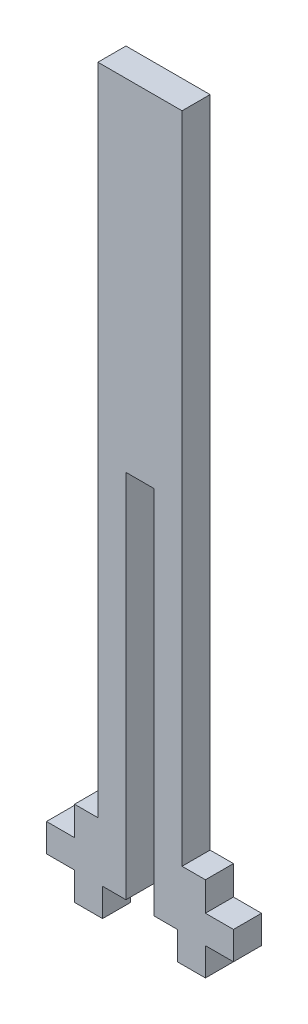
ISO-10303-21;
HEADER;
FILE_DESCRIPTION(('STEP AP214'),'2;1');
FILE_NAME('part.step','',(''),(''),'','','');
FILE_SCHEMA(('AUTOMOTIVE_DESIGN { 1 0 10303 214 1 1 1 1 }'));
ENDSEC;
DATA;
#1=APPLICATION_CONTEXT('core data for automotive mechanical design processes');
#2=APPLICATION_PROTOCOL_DEFINITION('international standard','automotive_design',2000,#1);
#3=PRODUCT_CONTEXT('',#1,'mechanical');
#4=PRODUCT('Part','Part','',(#3));
#5=PRODUCT_RELATED_PRODUCT_CATEGORY('part','',(#4));
#6=PRODUCT_DEFINITION_FORMATION('','',#4);
#7=PRODUCT_DEFINITION_CONTEXT('part definition',#1,'design');
#8=PRODUCT_DEFINITION('design','',#6,#7);
#9=PRODUCT_DEFINITION_SHAPE('','',#8);
#10=(LENGTH_UNIT() NAMED_UNIT(*) SI_UNIT(.MILLI.,.METRE.));
#11=(NAMED_UNIT(*) PLANE_ANGLE_UNIT() SI_UNIT($,.RADIAN.));
#12=(NAMED_UNIT(*) SI_UNIT($,.STERADIAN.) SOLID_ANGLE_UNIT());
#13=UNCERTAINTY_MEASURE_WITH_UNIT(LENGTH_MEASURE(1.E-05),#10,'distance_accuracy_value','');
#14=(GEOMETRIC_REPRESENTATION_CONTEXT(3) GLOBAL_UNCERTAINTY_ASSIGNED_CONTEXT((#13)) GLOBAL_UNIT_ASSIGNED_CONTEXT((#10,
#11,#12)) REPRESENTATION_CONTEXT('',''));
#15=CARTESIAN_POINT('',(0.,0.,0.));
#16=DIRECTION('',(0.,0.,1.));
#17=DIRECTION('',(1.,0.,0.));
#18=AXIS2_PLACEMENT_3D('',#15,#16,#17);
#19=CARTESIAN_POINT('',(7.,0.,3.));
#20=DIRECTION('',(-1.,0.,0.));
#21=DIRECTION('',(0.,0.,1.));
#22=AXIS2_PLACEMENT_3D('',#19,#20,#21);
#23=PLANE('',#22);
#24=DIRECTION('',(0.,0.,1.));
#25=VECTOR('',#24,1.);
#26=CARTESIAN_POINT('',(7.,-33.543999941,0.));
#27=LINE('',#26,#25);
#28=CARTESIAN_POINT('',(7.,-33.543999941,0.));
#29=VERTEX_POINT('',#28);
#30=CARTESIAN_POINT('',(7.,-33.543999941,3.));
#31=VERTEX_POINT('',#30);
#32=EDGE_CURVE('E252',#29,#31,#27,.T.);
#33=ORIENTED_EDGE('',*,*,#32,.F.);
#34=DIRECTION('',(0.,1.,0.));
#35=VECTOR('',#34,1.);
#36=CARTESIAN_POINT('',(7.,0.,0.));
#37=LINE('',#36,#35);
#38=CARTESIAN_POINT('',(7.,-30.443999941,0.));
#39=VERTEX_POINT('',#38);
#40=EDGE_CURVE('E416',#29,#39,#37,.T.);
#41=ORIENTED_EDGE('',*,*,#40,.T.);
#42=DIRECTION('',(0.,0.,-1.));
#43=VECTOR('',#42,1.);
#44=CARTESIAN_POINT('',(7.,-30.443999941,3.));
#45=LINE('',#44,#43);
#46=CARTESIAN_POINT('',(7.,-30.443999941,3.));
#47=VERTEX_POINT('',#46);
#48=EDGE_CURVE('E433',#47,#39,#45,.T.);
#49=ORIENTED_EDGE('',*,*,#48,.F.);
#50=DIRECTION('',(0.,1.,0.));
#51=VECTOR('',#50,1.);
#52=CARTESIAN_POINT('',(7.,0.,3.));
#53=LINE('',#52,#51);
#54=EDGE_CURVE('E375',#31,#47,#53,.T.);
#55=ORIENTED_EDGE('',*,*,#54,.F.);
#56=EDGE_LOOP('',(#33,#41,#49,#55));
#57=FACE_BOUND('',#56,.T.);
#58=ADVANCED_FACE('F47',(#57),#23,.F.);
#59=CARTESIAN_POINT('',(-7.,0.,3.));
#60=DIRECTION('',(1.,0.,0.));
#61=DIRECTION('',(0.,0.,-1.));
#62=AXIS2_PLACEMENT_3D('',#59,#60,#61);
#63=PLANE('',#62);
#64=DIRECTION('',(0.,0.,1.));
#65=VECTOR('',#64,1.);
#66=CARTESIAN_POINT('',(-7.,-36.543999941,0.));
#67=LINE('',#66,#65);
#68=CARTESIAN_POINT('',(-7.,-36.543999941,0.));
#69=VERTEX_POINT('',#68);
#70=CARTESIAN_POINT('',(-7.,-36.543999941,3.));
#71=VERTEX_POINT('',#70);
#72=EDGE_CURVE('E315',#69,#71,#67,.T.);
#73=ORIENTED_EDGE('',*,*,#72,.F.);
#74=DIRECTION('',(0.,-1.,0.));
#75=VECTOR('',#74,1.);
#76=CARTESIAN_POINT('',(-7.,0.,0.));
#77=LINE('',#76,#75);
#78=CARTESIAN_POINT('',(-7.,-39.543999941,0.));
#79=VERTEX_POINT('',#78);
#80=EDGE_CURVE('E398',#69,#79,#77,.T.);
#81=ORIENTED_EDGE('',*,*,#80,.T.);
#82=DIRECTION('',(0.,0.,-1.));
#83=VECTOR('',#82,1.);
#84=CARTESIAN_POINT('',(-7.,-39.543999941,3.));
#85=LINE('',#84,#83);
#86=CARTESIAN_POINT('',(-7.,-39.543999941,3.));
#87=VERTEX_POINT('',#86);
#88=EDGE_CURVE('E448',#87,#79,#85,.T.);
#89=ORIENTED_EDGE('',*,*,#88,.F.);
#90=DIRECTION('',(0.,-1.,0.));
#91=VECTOR('',#90,1.);
#92=CARTESIAN_POINT('',(-7.,0.,3.));
#93=LINE('',#92,#91);
#94=EDGE_CURVE('E359',#71,#87,#93,.T.);
#95=ORIENTED_EDGE('',*,*,#94,.F.);
#96=EDGE_LOOP('',(#73,#81,#89,#95));
#97=FACE_BOUND('',#96,.T.);
#98=ADVANCED_FACE('F494',(#97),#63,.F.);
#99=CARTESIAN_POINT('',(0.,39.543999941,3.));
#100=DIRECTION('',(0.,1.,0.));
#101=DIRECTION('',(0.,0.,1.));
#102=AXIS2_PLACEMENT_3D('',#99,#100,#101);
#103=PLANE('',#102);
#104=DIRECTION('',(1.,0.,0.));
#105=VECTOR('',#104,1.);
#106=CARTESIAN_POINT('',(0.,39.543999941,0.));
#107=LINE('',#106,#105);
#108=CARTESIAN_POINT('',(-4.5,39.543999941,0.));
#109=VERTEX_POINT('',#108);
#110=CARTESIAN_POINT('',(4.5,39.543999941,0.));
#111=VERTEX_POINT('',#110);
#112=EDGE_CURVE('E346',#109,#111,#107,.T.);
#113=ORIENTED_EDGE('',*,*,#112,.F.);
#114=DIRECTION('',(0.,0.,-1.));
#115=VECTOR('',#114,1.);
#116=CARTESIAN_POINT('',(-4.5,39.543999941,3.));
#117=LINE('',#116,#115);
#118=CARTESIAN_POINT('',(-4.5,39.543999941,3.));
#119=VERTEX_POINT('',#118);
#120=EDGE_CURVE('E11',#119,#109,#117,.T.);
#121=ORIENTED_EDGE('',*,*,#120,.F.);
#122=DIRECTION('',(1.,0.,0.));
#123=VECTOR('',#122,1.);
#124=CARTESIAN_POINT('',(0.,39.543999941,3.));
#125=LINE('',#124,#123);
#126=CARTESIAN_POINT('',(4.5,39.543999941,3.));
#127=VERTEX_POINT('',#126);
#128=EDGE_CURVE('E347',#119,#127,#125,.T.);
#129=ORIENTED_EDGE('',*,*,#128,.T.);
#130=DIRECTION('',(0.,0.,-1.));
#131=VECTOR('',#130,1.);
#132=CARTESIAN_POINT('',(4.5,39.543999941,3.));
#133=LINE('',#132,#131);
#134=EDGE_CURVE('E387',#127,#111,#133,.T.);
#135=ORIENTED_EDGE('',*,*,#134,.T.);
#136=EDGE_LOOP('',(#113,#121,#129,#135));
#137=FACE_BOUND('',#136,.T.);
#138=ADVANCED_FACE('F49',(#137),#103,.T.);
#139=CARTESIAN_POINT('',(-4.5,0.,3.));
#140=DIRECTION('',(-1.,0.,0.));
#141=DIRECTION('',(0.,0.,1.));
#142=AXIS2_PLACEMENT_3D('',#139,#140,#141);
#143=PLANE('',#142);
#144=DIRECTION('',(0.,1.,0.));
#145=VECTOR('',#144,1.);
#146=CARTESIAN_POINT('',(-4.5,0.,0.));
#147=LINE('',#146,#145);
#148=CARTESIAN_POINT('',(-4.5,-30.443999941,0.));
#149=VERTEX_POINT('',#148);
#150=EDGE_CURVE('E391',#149,#109,#147,.T.);
#151=ORIENTED_EDGE('',*,*,#150,.F.);
#152=DIRECTION('',(0.,0.,-1.));
#153=VECTOR('',#152,1.);
#154=CARTESIAN_POINT('',(-4.5,-30.443999941,3.));
#155=LINE('',#154,#153);
#156=CARTESIAN_POINT('',(-4.5,-30.443999941,3.));
#157=VERTEX_POINT('',#156);
#158=EDGE_CURVE('E56',#157,#149,#155,.T.);
#159=ORIENTED_EDGE('',*,*,#158,.F.);
#160=DIRECTION('',(0.,1.,0.));
#161=VECTOR('',#160,1.);
#162=CARTESIAN_POINT('',(-4.5,0.,3.));
#163=LINE('',#162,#161);
#164=EDGE_CURVE('E351',#157,#119,#163,.T.);
#165=ORIENTED_EDGE('',*,*,#164,.T.);
#166=ORIENTED_EDGE('',*,*,#120,.T.);
#167=EDGE_LOOP('',(#151,#159,#165,#166));
#168=FACE_BOUND('',#167,.T.);
#169=ADVANCED_FACE('F469',(#168),#143,.T.);
#170=CARTESIAN_POINT('',(0.,-30.443999941,3.));
#171=DIRECTION('',(0.,-1.,0.));
#172=DIRECTION('',(0.,0.,-1.));
#173=AXIS2_PLACEMENT_3D('',#170,#171,#172);
#174=PLANE('',#173);
#175=DIRECTION('',(-1.,0.,0.));
#176=VECTOR('',#175,1.);
#177=CARTESIAN_POINT('',(0.,-30.443999941,0.));
#178=LINE('',#177,#176);
#179=CARTESIAN_POINT('',(-7.,-30.443999941,0.));
#180=VERTEX_POINT('',#179);
#181=EDGE_CURVE('E395',#149,#180,#178,.T.);
#182=ORIENTED_EDGE('',*,*,#181,.T.);
#183=DIRECTION('',(0.,0.,-1.));
#184=VECTOR('',#183,1.);
#185=CARTESIAN_POINT('',(-7.,-30.443999941,3.));
#186=LINE('',#185,#184);
#187=CARTESIAN_POINT('',(-7.,-30.443999941,3.));
#188=VERTEX_POINT('',#187);
#189=EDGE_CURVE('E452',#188,#180,#186,.T.);
#190=ORIENTED_EDGE('',*,*,#189,.F.);
#191=DIRECTION('',(-1.,0.,0.));
#192=VECTOR('',#191,1.);
#193=CARTESIAN_POINT('',(0.,-30.443999941,3.));
#194=LINE('',#193,#192);
#195=EDGE_CURVE('E356',#157,#188,#194,.T.);
#196=ORIENTED_EDGE('',*,*,#195,.F.);
#197=ORIENTED_EDGE('',*,*,#158,.T.);
#198=EDGE_LOOP('',(#182,#190,#196,#197));
#199=FACE_BOUND('',#198,.T.);
#200=ADVANCED_FACE('F459',(#199),#174,.F.);
#201=CARTESIAN_POINT('',(-7.,-33.543999941,0.));
#202=VERTEX_POINT('',#201);
#203=EDGE_CURVE('E399',#180,#202,#77,.T.);
#204=ORIENTED_EDGE('',*,*,#203,.T.);
#205=DIRECTION('',(0.,0.,1.));
#206=VECTOR('',#205,1.);
#207=CARTESIAN_POINT('',(-7.,-33.543999941,0.));
#208=LINE('',#207,#206);
#209=CARTESIAN_POINT('',(-7.,-33.543999941,3.));
#210=VERTEX_POINT('',#209);
#211=EDGE_CURVE('E304',#202,#210,#208,.T.);
#212=ORIENTED_EDGE('',*,*,#211,.T.);
#213=EDGE_CURVE('E360',#188,#210,#93,.T.);
#214=ORIENTED_EDGE('',*,*,#213,.F.);
#215=ORIENTED_EDGE('',*,*,#189,.T.);
#216=EDGE_LOOP('',(#204,#212,#214,#215));
#217=FACE_BOUND('',#216,.T.);
#218=ADVANCED_FACE('F518',(#217),#63,.F.);
#219=CARTESIAN_POINT('',(0.,-39.543999941,3.));
#220=DIRECTION('',(0.,1.,0.));
#221=DIRECTION('',(0.,0.,1.));
#222=AXIS2_PLACEMENT_3D('',#219,#220,#221);
#223=PLANE('',#222);
#224=DIRECTION('',(1.,0.,0.));
#225=VECTOR('',#224,1.);
#226=CARTESIAN_POINT('',(0.,-39.543999941,0.));
#227=LINE('',#226,#225);
#228=CARTESIAN_POINT('',(-4.,-39.543999941,0.));
#229=VERTEX_POINT('',#228);
#230=EDGE_CURVE('E403',#79,#229,#227,.T.);
#231=ORIENTED_EDGE('',*,*,#230,.T.);
#232=DIRECTION('',(0.,0.,-1.));
#233=VECTOR('',#232,1.);
#234=CARTESIAN_POINT('',(-4.,-39.543999941,3.));
#235=LINE('',#234,#233);
#236=CARTESIAN_POINT('',(-4.,-39.543999941,3.));
#237=VERTEX_POINT('',#236);
#238=EDGE_CURVE('E444',#237,#229,#235,.T.);
#239=ORIENTED_EDGE('',*,*,#238,.F.);
#240=DIRECTION('',(1.,0.,0.));
#241=VECTOR('',#240,1.);
#242=CARTESIAN_POINT('',(0.,-39.543999941,3.));
#243=LINE('',#242,#241);
#244=EDGE_CURVE('E364',#87,#237,#243,.T.);
#245=ORIENTED_EDGE('',*,*,#244,.F.);
#246=ORIENTED_EDGE('',*,*,#88,.T.);
#247=EDGE_LOOP('',(#231,#239,#245,#246));
#248=FACE_BOUND('',#247,.T.);
#249=ADVANCED_FACE('F500',(#248),#223,.F.);
#250=CARTESIAN_POINT('',(-4.,0.,3.));
#251=DIRECTION('',(-1.,0.,0.));
#252=DIRECTION('',(0.,0.,1.));
#253=AXIS2_PLACEMENT_3D('',#250,#251,#252);
#254=PLANE('',#253);
#255=DIRECTION('',(0.,1.,0.));
#256=VECTOR('',#255,1.);
#257=CARTESIAN_POINT('',(-4.,0.,0.));
#258=LINE('',#257,#256);
#259=CARTESIAN_POINT('',(-4.,-36.543999941,0.));
#260=VERTEX_POINT('',#259);
#261=EDGE_CURVE('E406',#229,#260,#258,.T.);
#262=ORIENTED_EDGE('',*,*,#261,.T.);
#263=DIRECTION('',(0.,0.,1.));
#264=VECTOR('',#263,1.);
#265=CARTESIAN_POINT('',(-4.,-36.543999941,0.));
#266=LINE('',#265,#264);
#267=CARTESIAN_POINT('',(-4.,-36.543999941,3.));
#268=VERTEX_POINT('',#267);
#269=EDGE_CURVE('E246',#260,#268,#266,.T.);
#270=ORIENTED_EDGE('',*,*,#269,.T.);
#271=DIRECTION('',(0.,1.,0.));
#272=VECTOR('',#271,1.);
#273=CARTESIAN_POINT('',(-4.,0.,3.));
#274=LINE('',#273,#272);
#275=EDGE_CURVE('E367',#237,#268,#274,.T.);
#276=ORIENTED_EDGE('',*,*,#275,.F.);
#277=ORIENTED_EDGE('',*,*,#238,.T.);
#278=EDGE_LOOP('',(#262,#270,#276,#277));
#279=FACE_BOUND('',#278,.T.);
#280=ADVANCED_FACE('F504',(#279),#254,.F.);
#281=CARTESIAN_POINT('',(4.,0.,3.));
#282=DIRECTION('',(-1.,0.,0.));
#283=DIRECTION('',(0.,0.,1.));
#284=AXIS2_PLACEMENT_3D('',#281,#282,#283);
#285=PLANE('',#284);
#286=DIRECTION('',(0.,0.,1.));
#287=VECTOR('',#286,1.);
#288=CARTESIAN_POINT('',(4.,-36.543999941,0.));
#289=LINE('',#288,#287);
#290=CARTESIAN_POINT('',(4.,-36.543999941,0.));
#291=VERTEX_POINT('',#290);
#292=CARTESIAN_POINT('',(4.,-36.543999941,3.));
#293=VERTEX_POINT('',#292);
#294=EDGE_CURVE('E67',#291,#293,#289,.T.);
#295=ORIENTED_EDGE('',*,*,#294,.F.);
#296=DIRECTION('',(0.,1.,0.));
#297=VECTOR('',#296,1.);
#298=CARTESIAN_POINT('',(4.,0.,0.));
#299=LINE('',#298,#297);
#300=CARTESIAN_POINT('',(4.,-39.543999941,0.));
#301=VERTEX_POINT('',#300);
#302=EDGE_CURVE('E410',#301,#291,#299,.T.);
#303=ORIENTED_EDGE('',*,*,#302,.F.);
#304=DIRECTION('',(0.,0.,-1.));
#305=VECTOR('',#304,1.);
#306=CARTESIAN_POINT('',(4.,-39.543999941,3.));
#307=LINE('',#306,#305);
#308=CARTESIAN_POINT('',(4.,-39.543999941,3.));
#309=VERTEX_POINT('',#308);
#310=EDGE_CURVE('E441',#309,#301,#307,.T.);
#311=ORIENTED_EDGE('',*,*,#310,.F.);
#312=DIRECTION('',(0.,1.,0.));
#313=VECTOR('',#312,1.);
#314=CARTESIAN_POINT('',(4.,0.,3.));
#315=LINE('',#314,#313);
#316=EDGE_CURVE('E63',#309,#293,#315,.T.);
#317=ORIENTED_EDGE('',*,*,#316,.T.);
#318=EDGE_LOOP('',(#295,#303,#311,#317));
#319=FACE_BOUND('',#318,.T.);
#320=ADVANCED_FACE('F528',(#319),#285,.T.);
#321=CARTESIAN_POINT('',(0.,-39.543999941,3.));
#322=DIRECTION('',(0.,1.,0.));
#323=DIRECTION('',(0.,0.,1.));
#324=AXIS2_PLACEMENT_3D('',#321,#322,#323);
#325=PLANE('',#324);
#326=DIRECTION('',(1.,0.,0.));
#327=VECTOR('',#326,1.);
#328=CARTESIAN_POINT('',(0.,-39.543999941,0.));
#329=LINE('',#328,#327);
#330=CARTESIAN_POINT('',(7.,-39.543999941,0.));
#331=VERTEX_POINT('',#330);
#332=EDGE_CURVE('E413',#301,#331,#329,.T.);
#333=ORIENTED_EDGE('',*,*,#332,.T.);
#334=DIRECTION('',(0.,0.,-1.));
#335=VECTOR('',#334,1.);
#336=CARTESIAN_POINT('',(7.,-39.543999941,3.));
#337=LINE('',#336,#335);
#338=CARTESIAN_POINT('',(7.,-39.543999941,3.));
#339=VERTEX_POINT('',#338);
#340=EDGE_CURVE('E437',#339,#331,#337,.T.);
#341=ORIENTED_EDGE('',*,*,#340,.F.);
#342=DIRECTION('',(1.,0.,0.));
#343=VECTOR('',#342,1.);
#344=CARTESIAN_POINT('',(0.,-39.543999941,3.));
#345=LINE('',#344,#343);
#346=EDGE_CURVE('E372',#309,#339,#345,.T.);
#347=ORIENTED_EDGE('',*,*,#346,.F.);
#348=ORIENTED_EDGE('',*,*,#310,.T.);
#349=EDGE_LOOP('',(#333,#341,#347,#348));
#350=FACE_BOUND('',#349,.T.);
#351=ADVANCED_FACE('F522',(#350),#325,.F.);
#352=CARTESIAN_POINT('',(7.,-36.543999941,0.));
#353=VERTEX_POINT('',#352);
#354=EDGE_CURVE('E417',#331,#353,#37,.T.);
#355=ORIENTED_EDGE('',*,*,#354,.T.);
#356=DIRECTION('',(0.,0.,1.));
#357=VECTOR('',#356,1.);
#358=CARTESIAN_POINT('',(7.,-36.543999941,0.));
#359=LINE('',#358,#357);
#360=CARTESIAN_POINT('',(7.,-36.543999941,3.));
#361=VERTEX_POINT('',#360);
#362=EDGE_CURVE('E256',#353,#361,#359,.T.);
#363=ORIENTED_EDGE('',*,*,#362,.T.);
#364=EDGE_CURVE('E376',#339,#361,#53,.T.);
#365=ORIENTED_EDGE('',*,*,#364,.F.);
#366=ORIENTED_EDGE('',*,*,#340,.T.);
#367=EDGE_LOOP('',(#355,#363,#365,#366));
#368=FACE_BOUND('',#367,.T.);
#369=ADVANCED_FACE('F513',(#368),#23,.F.);
#370=CARTESIAN_POINT('',(0.,-30.443999941,3.));
#371=DIRECTION('',(0.,-1.,0.));
#372=DIRECTION('',(0.,0.,-1.));
#373=AXIS2_PLACEMENT_3D('',#370,#371,#372);
#374=PLANE('',#373);
#375=DIRECTION('',(-1.,0.,0.));
#376=VECTOR('',#375,1.);
#377=CARTESIAN_POINT('',(0.,-30.443999941,0.));
#378=LINE('',#377,#376);
#379=CARTESIAN_POINT('',(4.5,-30.443999941,0.));
#380=VERTEX_POINT('',#379);
#381=EDGE_CURVE('E421',#39,#380,#378,.T.);
#382=ORIENTED_EDGE('',*,*,#381,.T.);
#383=DIRECTION('',(0.,0.,-1.));
#384=VECTOR('',#383,1.);
#385=CARTESIAN_POINT('',(4.5,-30.443999941,3.));
#386=LINE('',#385,#384);
#387=CARTESIAN_POINT('',(4.5,-30.443999941,3.));
#388=VERTEX_POINT('',#387);
#389=EDGE_CURVE('E430',#388,#380,#386,.T.);
#390=ORIENTED_EDGE('',*,*,#389,.F.);
#391=DIRECTION('',(-1.,0.,0.));
#392=VECTOR('',#391,1.);
#393=CARTESIAN_POINT('',(0.,-30.443999941,3.));
#394=LINE('',#393,#392);
#395=EDGE_CURVE('E380',#47,#388,#394,.T.);
#396=ORIENTED_EDGE('',*,*,#395,.F.);
#397=ORIENTED_EDGE('',*,*,#48,.T.);
#398=EDGE_LOOP('',(#382,#390,#396,#397));
#399=FACE_BOUND('',#398,.T.);
#400=ADVANCED_FACE('F481',(#399),#374,.F.);
#401=CARTESIAN_POINT('',(4.5,0.,3.));
#402=DIRECTION('',(1.,0.,0.));
#403=DIRECTION('',(0.,0.,-1.));
#404=AXIS2_PLACEMENT_3D('',#401,#402,#403);
#405=PLANE('',#404);
#406=DIRECTION('',(0.,-1.,0.));
#407=VECTOR('',#406,1.);
#408=CARTESIAN_POINT('',(4.5,0.,0.));
#409=LINE('',#408,#407);
#410=EDGE_CURVE('E352',#111,#380,#409,.T.);
#411=ORIENTED_EDGE('',*,*,#410,.F.);
#412=ORIENTED_EDGE('',*,*,#134,.F.);
#413=DIRECTION('',(0.,-1.,0.));
#414=VECTOR('',#413,1.);
#415=CARTESIAN_POINT('',(4.5,0.,3.));
#416=LINE('',#415,#414);
#417=EDGE_CURVE('E383',#127,#388,#416,.T.);
#418=ORIENTED_EDGE('',*,*,#417,.T.);
#419=ORIENTED_EDGE('',*,*,#389,.T.);
#420=EDGE_LOOP('',(#411,#412,#418,#419));
#421=FACE_BOUND('',#420,.T.);
#422=ADVANCED_FACE('F476',(#421),#405,.T.);
#423=CARTESIAN_POINT('',(0.,0.,3.));
#424=DIRECTION('',(0.,0.,1.));
#425=DIRECTION('',(1.,0.,0.));
#426=AXIS2_PLACEMENT_3D('',#423,#424,#425);
#427=PLANE('',#426);
#428=ORIENTED_EDGE('',*,*,#275,.T.);
#429=DIRECTION('',(1.,0.,0.));
#430=VECTOR('',#429,1.);
#431=CARTESIAN_POINT('',(-4.,-36.543999941,3.));
#432=LINE('',#431,#430);
#433=CARTESIAN_POINT('',(-1.5,-36.543999941,3.));
#434=VERTEX_POINT('',#433);
#435=EDGE_CURVE('E234',#268,#434,#432,.T.);
#436=ORIENTED_EDGE('',*,*,#435,.T.);
#437=DIRECTION('',(0.,1.,0.));
#438=VECTOR('',#437,1.);
#439=CARTESIAN_POINT('',(-1.5,-33.443999941,3.));
#440=LINE('',#439,#438);
#441=CARTESIAN_POINT('',(-1.50000000000001,3.05,3.));
#442=VERTEX_POINT('',#441);
#443=EDGE_CURVE('E218',#434,#442,#440,.T.);
#444=ORIENTED_EDGE('',*,*,#443,.T.);
#445=DIRECTION('',(1.,0.,0.));
#446=VECTOR('',#445,1.);
#447=CARTESIAN_POINT('',(1.49999999999999,3.05,3.));
#448=LINE('',#447,#446);
#449=CARTESIAN_POINT('',(1.49999999999999,3.05,3.));
#450=VERTEX_POINT('',#449);
#451=EDGE_CURVE('E214',#442,#450,#448,.T.);
#452=ORIENTED_EDGE('',*,*,#451,.T.);
#453=DIRECTION('',(0.,-1.,0.));
#454=VECTOR('',#453,1.);
#455=CARTESIAN_POINT('',(1.5,-33.443999941,3.));
#456=LINE('',#455,#454);
#457=CARTESIAN_POINT('',(1.5,-36.543999941,3.));
#458=VERTEX_POINT('',#457);
#459=EDGE_CURVE('E207',#450,#458,#456,.T.);
#460=ORIENTED_EDGE('',*,*,#459,.T.);
#461=DIRECTION('',(1.,0.,0.));
#462=VECTOR('',#461,1.);
#463=CARTESIAN_POINT('',(1.5,-36.543999941,3.));
#464=LINE('',#463,#462);
#465=EDGE_CURVE('E212',#458,#293,#464,.T.);
#466=ORIENTED_EDGE('',*,*,#465,.T.);
#467=ORIENTED_EDGE('',*,*,#316,.F.);
#468=ORIENTED_EDGE('',*,*,#346,.T.);
#469=ORIENTED_EDGE('',*,*,#364,.T.);
#470=DIRECTION('',(1.,0.,0.));
#471=VECTOR('',#470,1.);
#472=CARTESIAN_POINT('',(7.,-36.543999941,3.));
#473=LINE('',#472,#471);
#474=CARTESIAN_POINT('',(10.,-36.543999941,3.));
#475=VERTEX_POINT('',#474);
#476=EDGE_CURVE('E278',#361,#475,#473,.T.);
#477=ORIENTED_EDGE('',*,*,#476,.T.);
#478=DIRECTION('',(0.,1.,0.));
#479=VECTOR('',#478,1.);
#480=CARTESIAN_POINT('',(10.,-33.543999941,3.));
#481=LINE('',#480,#479);
#482=CARTESIAN_POINT('',(10.,-33.543999941,3.));
#483=VERTEX_POINT('',#482);
#484=EDGE_CURVE('E273',#475,#483,#481,.T.);
#485=ORIENTED_EDGE('',*,*,#484,.T.);
#486=DIRECTION('',(-1.,0.,0.));
#487=VECTOR('',#486,1.);
#488=CARTESIAN_POINT('',(7.,-33.543999941,3.));
#489=LINE('',#488,#487);
#490=EDGE_CURVE('E269',#483,#31,#489,.T.);
#491=ORIENTED_EDGE('',*,*,#490,.T.);
#492=ORIENTED_EDGE('',*,*,#54,.T.);
#493=ORIENTED_EDGE('',*,*,#395,.T.);
#494=ORIENTED_EDGE('',*,*,#417,.F.);
#495=ORIENTED_EDGE('',*,*,#128,.F.);
#496=ORIENTED_EDGE('',*,*,#164,.F.);
#497=ORIENTED_EDGE('',*,*,#195,.T.);
#498=ORIENTED_EDGE('',*,*,#213,.T.);
#499=DIRECTION('',(-1.,0.,0.));
#500=VECTOR('',#499,1.);
#501=CARTESIAN_POINT('',(-7.,-33.543999941,3.));
#502=LINE('',#501,#500);
#503=CARTESIAN_POINT('',(-10.,-33.543999941,3.));
#504=VERTEX_POINT('',#503);
#505=EDGE_CURVE('E282',#210,#504,#502,.T.);
#506=ORIENTED_EDGE('',*,*,#505,.T.);
#507=DIRECTION('',(0.,-1.,0.));
#508=VECTOR('',#507,1.);
#509=CARTESIAN_POINT('',(-10.,-33.543999941,3.));
#510=LINE('',#509,#508);
#511=CARTESIAN_POINT('',(-10.,-36.543999941,3.));
#512=VERTEX_POINT('',#511);
#513=EDGE_CURVE('E308',#504,#512,#510,.T.);
#514=ORIENTED_EDGE('',*,*,#513,.T.);
#515=DIRECTION('',(1.,0.,0.));
#516=VECTOR('',#515,1.);
#517=CARTESIAN_POINT('',(-7.,-36.543999941,3.));
#518=LINE('',#517,#516);
#519=EDGE_CURVE('E297',#512,#71,#518,.T.);
#520=ORIENTED_EDGE('',*,*,#519,.T.);
#521=ORIENTED_EDGE('',*,*,#94,.T.);
#522=ORIENTED_EDGE('',*,*,#244,.T.);
#523=EDGE_LOOP('',(#428,#436,#444,#452,#460,#466,#467,#468,#469,#477,#485,#491,#492,#493,#494,
#495,#496,#497,#498,#506,#514,#520,#521,#522));
#524=FACE_BOUND('',#523,.T.);
#525=ADVANCED_FACE('F210',(#524),#427,.T.);
#526=CARTESIAN_POINT('',(0.,0.,0.));
#527=DIRECTION('',(0.,0.,1.));
#528=DIRECTION('',(1.,0.,0.));
#529=AXIS2_PLACEMENT_3D('',#526,#527,#528);
#530=PLANE('',#529);
#531=DIRECTION('',(1.,0.,0.));
#532=VECTOR('',#531,1.);
#533=CARTESIAN_POINT('',(-4.,-36.543999941,0.));
#534=LINE('',#533,#532);
#535=CARTESIAN_POINT('',(-1.5,-36.543999941,0.));
#536=VERTEX_POINT('',#535);
#537=EDGE_CURVE('E239',#260,#536,#534,.T.);
#538=ORIENTED_EDGE('',*,*,#537,.F.);
#539=ORIENTED_EDGE('',*,*,#261,.F.);
#540=ORIENTED_EDGE('',*,*,#230,.F.);
#541=ORIENTED_EDGE('',*,*,#80,.F.);
#542=DIRECTION('',(1.,0.,0.));
#543=VECTOR('',#542,1.);
#544=CARTESIAN_POINT('',(-7.,-36.543999941,0.));
#545=LINE('',#544,#543);
#546=CARTESIAN_POINT('',(-10.,-36.543999941,0.));
#547=VERTEX_POINT('',#546);
#548=EDGE_CURVE('E301',#547,#69,#545,.T.);
#549=ORIENTED_EDGE('',*,*,#548,.F.);
#550=DIRECTION('',(0.,-1.,0.));
#551=VECTOR('',#550,1.);
#552=CARTESIAN_POINT('',(-10.,-33.543999941,0.));
#553=LINE('',#552,#551);
#554=CARTESIAN_POINT('',(-10.,-33.543999941,0.));
#555=VERTEX_POINT('',#554);
#556=EDGE_CURVE('E296',#555,#547,#553,.T.);
#557=ORIENTED_EDGE('',*,*,#556,.F.);
#558=DIRECTION('',(-1.,0.,0.));
#559=VECTOR('',#558,1.);
#560=CARTESIAN_POINT('',(-7.,-33.543999941,0.));
#561=LINE('',#560,#559);
#562=EDGE_CURVE('E292',#202,#555,#561,.T.);
#563=ORIENTED_EDGE('',*,*,#562,.F.);
#564=ORIENTED_EDGE('',*,*,#203,.F.);
#565=ORIENTED_EDGE('',*,*,#181,.F.);
#566=ORIENTED_EDGE('',*,*,#150,.T.);
#567=ORIENTED_EDGE('',*,*,#112,.T.);
#568=ORIENTED_EDGE('',*,*,#410,.T.);
#569=ORIENTED_EDGE('',*,*,#381,.F.);
#570=ORIENTED_EDGE('',*,*,#40,.F.);
#571=DIRECTION('',(-1.,0.,0.));
#572=VECTOR('',#571,1.);
#573=CARTESIAN_POINT('',(7.,-33.543999941,0.));
#574=LINE('',#573,#572);
#575=CARTESIAN_POINT('',(10.,-33.543999941,0.));
#576=VERTEX_POINT('',#575);
#577=EDGE_CURVE('E260',#576,#29,#574,.T.);
#578=ORIENTED_EDGE('',*,*,#577,.F.);
#579=DIRECTION('',(0.,1.,0.));
#580=VECTOR('',#579,1.);
#581=CARTESIAN_POINT('',(10.,-33.543999941,0.));
#582=LINE('',#581,#580);
#583=CARTESIAN_POINT('',(10.,-36.543999941,0.));
#584=VERTEX_POINT('',#583);
#585=EDGE_CURVE('E285',#584,#576,#582,.T.);
#586=ORIENTED_EDGE('',*,*,#585,.F.);
#587=DIRECTION('',(1.,0.,0.));
#588=VECTOR('',#587,1.);
#589=CARTESIAN_POINT('',(7.,-36.543999941,0.));
#590=LINE('',#589,#588);
#591=EDGE_CURVE('E274',#353,#584,#590,.T.);
#592=ORIENTED_EDGE('',*,*,#591,.F.);
#593=ORIENTED_EDGE('',*,*,#354,.F.);
#594=ORIENTED_EDGE('',*,*,#332,.F.);
#595=ORIENTED_EDGE('',*,*,#302,.T.);
#596=DIRECTION('',(1.,0.,0.));
#597=VECTOR('',#596,1.);
#598=CARTESIAN_POINT('',(1.5,-36.543999941,0.));
#599=LINE('',#598,#597);
#600=CARTESIAN_POINT('',(1.5,-36.543999941,0.));
#601=VERTEX_POINT('',#600);
#602=EDGE_CURVE('E230',#601,#291,#599,.T.);
#603=ORIENTED_EDGE('',*,*,#602,.F.);
#604=DIRECTION('',(0.,-1.,0.));
#605=VECTOR('',#604,1.);
#606=CARTESIAN_POINT('',(1.5,-33.443999941,0.));
#607=LINE('',#606,#605);
#608=CARTESIAN_POINT('',(1.49999999999999,3.05,0.));
#609=VERTEX_POINT('',#608);
#610=EDGE_CURVE('E225',#609,#601,#607,.T.);
#611=ORIENTED_EDGE('',*,*,#610,.F.);
#612=DIRECTION('',(1.,0.,0.));
#613=VECTOR('',#612,1.);
#614=CARTESIAN_POINT('',(1.49999999999999,3.05,0.));
#615=LINE('',#614,#613);
#616=CARTESIAN_POINT('',(-1.50000000000001,3.05,0.));
#617=VERTEX_POINT('',#616);
#618=EDGE_CURVE('E330',#617,#609,#615,.T.);
#619=ORIENTED_EDGE('',*,*,#618,.F.);
#620=DIRECTION('',(0.,1.,0.));
#621=VECTOR('',#620,1.);
#622=CARTESIAN_POINT('',(-1.5,-33.443999941,0.));
#623=LINE('',#622,#621);
#624=EDGE_CURVE('E318',#536,#617,#623,.T.);
#625=ORIENTED_EDGE('',*,*,#624,.F.);
#626=EDGE_LOOP('',(#538,#539,#540,#541,#549,#557,#563,#564,#565,#566,#567,#568,#569,#570,#578,
#586,#592,#593,#594,#595,#603,#611,#619,#625));
#627=FACE_BOUND('',#626,.T.);
#628=ADVANCED_FACE('F467',(#627),#530,.F.);
#629=CARTESIAN_POINT('',(1.49999999999999,3.05,39.6171002633156));
#630=DIRECTION('',(0.,1.,0.));
#631=DIRECTION('',(0.,0.,1.));
#632=AXIS2_PLACEMENT_3D('',#629,#630,#631);
#633=PLANE('',#632);
#634=DIRECTION('',(0.,0.,-1.));
#635=VECTOR('',#634,1.);
#636=CARTESIAN_POINT('',(-1.50000000000001,3.05,39.6171002633156));
#637=LINE('',#636,#635);
#638=EDGE_CURVE('E340',#442,#617,#637,.T.);
#639=ORIENTED_EDGE('',*,*,#638,.T.);
#640=ORIENTED_EDGE('',*,*,#618,.T.);
#641=DIRECTION('',(0.,0.,-1.));
#642=VECTOR('',#641,1.);
#643=CARTESIAN_POINT('',(1.49999999999999,3.05,39.6171002633156));
#644=LINE('',#643,#642);
#645=EDGE_CURVE('E219',#450,#609,#644,.T.);
#646=ORIENTED_EDGE('',*,*,#645,.F.);
#647=ORIENTED_EDGE('',*,*,#451,.F.);
#648=EDGE_LOOP('',(#639,#640,#646,#647));
#649=FACE_BOUND('',#648,.T.);
#650=ADVANCED_FACE('F542',(#649),#633,.F.);
#651=CARTESIAN_POINT('',(1.5,-33.443999941,39.6171002633156));
#652=DIRECTION('',(1.,0.,0.));
#653=DIRECTION('',(0.,1.,0.));
#654=AXIS2_PLACEMENT_3D('',#651,#652,#653);
#655=PLANE('',#654);
#656=ORIENTED_EDGE('',*,*,#645,.T.);
#657=ORIENTED_EDGE('',*,*,#610,.T.);
#658=DIRECTION('',(0.,0.,1.));
#659=VECTOR('',#658,1.);
#660=CARTESIAN_POINT('',(1.5,-36.543999941,0.));
#661=LINE('',#660,#659);
#662=EDGE_CURVE('E222',#601,#458,#661,.T.);
#663=ORIENTED_EDGE('',*,*,#662,.T.);
#664=ORIENTED_EDGE('',*,*,#459,.F.);
#665=EDGE_LOOP('',(#656,#657,#663,#664));
#666=FACE_BOUND('',#665,.T.);
#667=ADVANCED_FACE('F223',(#666),#655,.F.);
#668=CARTESIAN_POINT('',(-1.5,-33.443999941,39.6171002633156));
#669=DIRECTION('',(-1.,0.,0.));
#670=DIRECTION('',(0.,-1.,0.));
#671=AXIS2_PLACEMENT_3D('',#668,#669,#670);
#672=PLANE('',#671);
#673=ORIENTED_EDGE('',*,*,#443,.F.);
#674=DIRECTION('',(0.,0.,1.));
#675=VECTOR('',#674,1.);
#676=CARTESIAN_POINT('',(-1.5,-36.543999941,0.));
#677=LINE('',#676,#675);
#678=EDGE_CURVE('E248',#536,#434,#677,.T.);
#679=ORIENTED_EDGE('',*,*,#678,.F.);
#680=ORIENTED_EDGE('',*,*,#624,.T.);
#681=ORIENTED_EDGE('',*,*,#638,.F.);
#682=EDGE_LOOP('',(#673,#679,#680,#681));
#683=FACE_BOUND('',#682,.T.);
#684=ADVANCED_FACE('F545',(#683),#672,.F.);
#685=CARTESIAN_POINT('',(-7.,-36.543999941,0.));
#686=DIRECTION('',(0.,-1.,0.));
#687=DIRECTION('',(0.,0.,-1.));
#688=AXIS2_PLACEMENT_3D('',#685,#686,#687);
#689=PLANE('',#688);
#690=ORIENTED_EDGE('',*,*,#519,.F.);
#691=DIRECTION('',(0.,0.,1.));
#692=VECTOR('',#691,1.);
#693=CARTESIAN_POINT('',(-10.,-36.543999941,0.));
#694=LINE('',#693,#692);
#695=EDGE_CURVE('E319',#547,#512,#694,.T.);
#696=ORIENTED_EDGE('',*,*,#695,.F.);
#697=ORIENTED_EDGE('',*,*,#548,.T.);
#698=ORIENTED_EDGE('',*,*,#72,.T.);
#699=EDGE_LOOP('',(#690,#696,#697,#698));
#700=FACE_BOUND('',#699,.T.);
#701=ADVANCED_FACE('F566',(#700),#689,.T.);
#702=CARTESIAN_POINT('',(-10.,-33.543999941,0.));
#703=DIRECTION('',(-1.,0.,0.));
#704=DIRECTION('',(0.,-1.,0.));
#705=AXIS2_PLACEMENT_3D('',#702,#703,#704);
#706=PLANE('',#705);
#707=ORIENTED_EDGE('',*,*,#513,.F.);
#708=DIRECTION('',(0.,0.,1.));
#709=VECTOR('',#708,1.);
#710=CARTESIAN_POINT('',(-10.,-33.543999941,0.));
#711=LINE('',#710,#709);
#712=EDGE_CURVE('E322',#555,#504,#711,.T.);
#713=ORIENTED_EDGE('',*,*,#712,.F.);
#714=ORIENTED_EDGE('',*,*,#556,.T.);
#715=ORIENTED_EDGE('',*,*,#695,.T.);
#716=EDGE_LOOP('',(#707,#713,#714,#715));
#717=FACE_BOUND('',#716,.T.);
#718=ADVANCED_FACE('F569',(#717),#706,.T.);
#719=CARTESIAN_POINT('',(-7.,-33.543999941,0.));
#720=DIRECTION('',(0.,1.,0.));
#721=DIRECTION('',(0.,0.,1.));
#722=AXIS2_PLACEMENT_3D('',#719,#720,#721);
#723=PLANE('',#722);
#724=ORIENTED_EDGE('',*,*,#505,.F.);
#725=ORIENTED_EDGE('',*,*,#211,.F.);
#726=ORIENTED_EDGE('',*,*,#562,.T.);
#727=ORIENTED_EDGE('',*,*,#712,.T.);
#728=EDGE_LOOP('',(#724,#725,#726,#727));
#729=FACE_BOUND('',#728,.T.);
#730=ADVANCED_FACE('F564',(#729),#723,.T.);
#731=CARTESIAN_POINT('',(7.,-33.543999941,0.));
#732=DIRECTION('',(0.,1.,0.));
#733=DIRECTION('',(0.,0.,1.));
#734=AXIS2_PLACEMENT_3D('',#731,#732,#733);
#735=PLANE('',#734);
#736=ORIENTED_EDGE('',*,*,#490,.F.);
#737=DIRECTION('',(0.,0.,1.));
#738=VECTOR('',#737,1.);
#739=CARTESIAN_POINT('',(10.,-33.543999941,0.));
#740=LINE('',#739,#738);
#741=EDGE_CURVE('E264',#576,#483,#740,.T.);
#742=ORIENTED_EDGE('',*,*,#741,.F.);
#743=ORIENTED_EDGE('',*,*,#577,.T.);
#744=ORIENTED_EDGE('',*,*,#32,.T.);
#745=EDGE_LOOP('',(#736,#742,#743,#744));
#746=FACE_BOUND('',#745,.T.);
#747=ADVANCED_FACE('F560',(#746),#735,.T.);
#748=CARTESIAN_POINT('',(10.,-33.543999941,0.));
#749=DIRECTION('',(1.,0.,0.));
#750=DIRECTION('',(0.,1.,0.));
#751=AXIS2_PLACEMENT_3D('',#748,#749,#750);
#752=PLANE('',#751);
#753=ORIENTED_EDGE('',*,*,#484,.F.);
#754=DIRECTION('',(0.,0.,1.));
#755=VECTOR('',#754,1.);
#756=CARTESIAN_POINT('',(10.,-36.543999941,0.));
#757=LINE('',#756,#755);
#758=EDGE_CURVE('E261',#584,#475,#757,.T.);
#759=ORIENTED_EDGE('',*,*,#758,.F.);
#760=ORIENTED_EDGE('',*,*,#585,.T.);
#761=ORIENTED_EDGE('',*,*,#741,.T.);
#762=EDGE_LOOP('',(#753,#759,#760,#761));
#763=FACE_BOUND('',#762,.T.);
#764=ADVANCED_FACE('F555',(#763),#752,.T.);
#765=CARTESIAN_POINT('',(7.,-36.543999941,0.));
#766=DIRECTION('',(0.,-1.,0.));
#767=DIRECTION('',(0.,0.,-1.));
#768=AXIS2_PLACEMENT_3D('',#765,#766,#767);
#769=PLANE('',#768);
#770=ORIENTED_EDGE('',*,*,#476,.F.);
#771=ORIENTED_EDGE('',*,*,#362,.F.);
#772=ORIENTED_EDGE('',*,*,#591,.T.);
#773=ORIENTED_EDGE('',*,*,#758,.T.);
#774=EDGE_LOOP('',(#770,#771,#772,#773));
#775=FACE_BOUND('',#774,.T.);
#776=ADVANCED_FACE('F536',(#775),#769,.T.);
#777=CARTESIAN_POINT('',(-4.,-36.543999941,0.));
#778=DIRECTION('',(0.,-1.,0.));
#779=DIRECTION('',(0.,0.,-1.));
#780=AXIS2_PLACEMENT_3D('',#777,#778,#779);
#781=PLANE('',#780);
#782=ORIENTED_EDGE('',*,*,#435,.F.);
#783=ORIENTED_EDGE('',*,*,#269,.F.);
#784=ORIENTED_EDGE('',*,*,#537,.T.);
#785=ORIENTED_EDGE('',*,*,#678,.T.);
#786=EDGE_LOOP('',(#782,#783,#784,#785));
#787=FACE_BOUND('',#786,.T.);
#788=ADVANCED_FACE('F547',(#787),#781,.T.);
#789=CARTESIAN_POINT('',(1.5,-36.543999941,0.));
#790=DIRECTION('',(0.,-1.,0.));
#791=DIRECTION('',(0.,0.,-1.));
#792=AXIS2_PLACEMENT_3D('',#789,#790,#791);
#793=PLANE('',#792);
#794=ORIENTED_EDGE('',*,*,#465,.F.);
#795=ORIENTED_EDGE('',*,*,#662,.F.);
#796=ORIENTED_EDGE('',*,*,#602,.T.);
#797=ORIENTED_EDGE('',*,*,#294,.T.);
#798=EDGE_LOOP('',(#794,#795,#796,#797));
#799=FACE_BOUND('',#798,.T.);
#800=ADVANCED_FACE('F232',(#799),#793,.T.);
#801=CLOSED_SHELL('',(#58,#98,#138,#169,#200,#218,#249,#280,#320,#351,#369,#400,#422,#525,#628,
#650,#667,#684,#701,#718,#730,#747,#764,#776,#788,#800));
#802=MANIFOLD_SOLID_BREP('B2',#801);
#803=ADVANCED_BREP_SHAPE_REPRESENTATION('',(#18,#802),#14);
#804=SHAPE_DEFINITION_REPRESENTATION(#9,#803);
ENDSEC;
END-ISO-10303-21;
